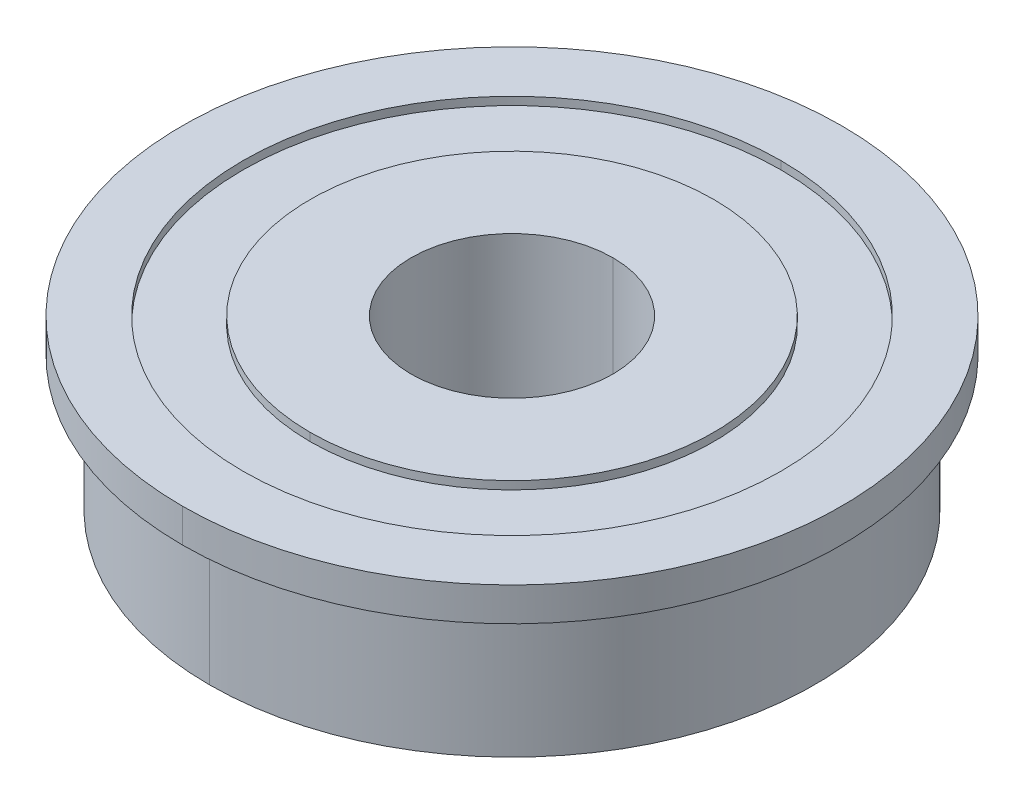
ISO-10303-21;
HEADER;
FILE_DESCRIPTION(('STEP AP214'),'2;1');
FILE_NAME('part.step','',(''),(''),'','','');
FILE_SCHEMA(('AUTOMOTIVE_DESIGN { 1 0 10303 214 1 1 1 1 }'));
ENDSEC;
DATA;
#1=APPLICATION_CONTEXT('core data for automotive mechanical design processes');
#2=APPLICATION_PROTOCOL_DEFINITION('international standard','automotive_design',2000,#1);
#3=PRODUCT_CONTEXT('',#1,'mechanical');
#4=PRODUCT('Part','Part','',(#3));
#5=PRODUCT_RELATED_PRODUCT_CATEGORY('part','',(#4));
#6=PRODUCT_DEFINITION_FORMATION('','',#4);
#7=PRODUCT_DEFINITION_CONTEXT('part definition',#1,'design');
#8=PRODUCT_DEFINITION('design','',#6,#7);
#9=PRODUCT_DEFINITION_SHAPE('','',#8);
#10=(LENGTH_UNIT() NAMED_UNIT(*) SI_UNIT(.MILLI.,.METRE.));
#11=(NAMED_UNIT(*) PLANE_ANGLE_UNIT() SI_UNIT($,.RADIAN.));
#12=(NAMED_UNIT(*) SI_UNIT($,.STERADIAN.) SOLID_ANGLE_UNIT());
#13=UNCERTAINTY_MEASURE_WITH_UNIT(LENGTH_MEASURE(1.E-05),#10,'distance_accuracy_value','');
#14=(GEOMETRIC_REPRESENTATION_CONTEXT(3) GLOBAL_UNCERTAINTY_ASSIGNED_CONTEXT((#13)) GLOBAL_UNIT_ASSIGNED_CONTEXT((#10,
#11,#12)) REPRESENTATION_CONTEXT('',''));
#15=CARTESIAN_POINT('',(0.,0.,0.));
#16=DIRECTION('',(0.,0.,1.));
#17=DIRECTION('',(1.,0.,0.));
#18=AXIS2_PLACEMENT_3D('',#15,#16,#17);
#19=CARTESIAN_POINT('',(0.,0.,0.));
#20=DIRECTION('',(0.,1.,0.));
#21=DIRECTION('',(0.,0.,1.));
#22=AXIS2_PLACEMENT_3D('',#19,#20,#21);
#23=CYLINDRICAL_SURFACE('',#22,12.7);
#24=CARTESIAN_POINT('',(0.,7.5565,0.));
#25=DIRECTION('',(0.,1.,0.));
#26=DIRECTION('',(0.,0.,1.));
#27=AXIS2_PLACEMENT_3D('',#24,#25,#26);
#28=CIRCLE('',#27,12.7);
#29=CARTESIAN_POINT('',(0.,7.5565,-12.7));
#30=VERTEX_POINT('',#29);
#31=CARTESIAN_POINT('',(0.,7.5565,12.7));
#32=VERTEX_POINT('',#31);
#33=EDGE_CURVE('E39',#30,#32,#28,.T.);
#34=ORIENTED_EDGE('',*,*,#33,.F.);
#35=DIRECTION('',(0.,1.,0.));
#36=VECTOR('',#35,1.);
#37=CARTESIAN_POINT('',(0.,0.,-12.7));
#38=LINE('',#37,#36);
#39=CARTESIAN_POINT('',(0.,7.9375,-12.7));
#40=VERTEX_POINT('',#39);
#41=EDGE_CURVE('E10',#30,#40,#38,.T.);
#42=ORIENTED_EDGE('',*,*,#41,.T.);
#43=CARTESIAN_POINT('',(0.,7.9375,0.));
#44=DIRECTION('',(0.,1.,0.));
#45=DIRECTION('',(0.,0.,1.));
#46=AXIS2_PLACEMENT_3D('',#43,#44,#45);
#47=CIRCLE('',#46,12.7);
#48=CARTESIAN_POINT('',(0.,7.9375,12.7));
#49=VERTEX_POINT('',#48);
#50=EDGE_CURVE('E27',#40,#49,#47,.T.);
#51=ORIENTED_EDGE('',*,*,#50,.T.);
#52=DIRECTION('',(0.,1.,0.));
#53=VECTOR('',#52,1.);
#54=CARTESIAN_POINT('',(0.,0.,12.7));
#55=LINE('',#54,#53);
#56=EDGE_CURVE('E118',#32,#49,#55,.T.);
#57=ORIENTED_EDGE('',*,*,#56,.F.);
#58=EDGE_LOOP('',(#34,#42,#51,#57));
#59=FACE_BOUND('',#58,.T.);
#60=ADVANCED_FACE('F16',(#59),#23,.F.);
#61=CARTESIAN_POINT('',(0.,0.,0.));
#62=DIRECTION('',(0.,1.,0.));
#63=DIRECTION('',(0.,0.,1.));
#64=AXIS2_PLACEMENT_3D('',#61,#62,#63);
#65=CYLINDRICAL_SURFACE('',#64,15.5575);
#66=CARTESIAN_POINT('',(0.,6.35,0.));
#67=DIRECTION('',(0.,1.,0.));
#68=DIRECTION('',(0.,0.,1.));
#69=AXIS2_PLACEMENT_3D('',#66,#67,#68);
#70=CIRCLE('',#69,15.5575);
#71=CARTESIAN_POINT('',(0.,6.35,15.5575));
#72=VERTEX_POINT('',#71);
#73=CARTESIAN_POINT('',(0.,6.35,-15.5575));
#74=VERTEX_POINT('',#73);
#75=EDGE_CURVE('E130',#72,#74,#70,.T.);
#76=ORIENTED_EDGE('',*,*,#75,.T.);
#77=DIRECTION('',(0.,1.,0.));
#78=VECTOR('',#77,1.);
#79=CARTESIAN_POINT('',(0.,0.,-15.5575));
#80=LINE('',#79,#78);
#81=CARTESIAN_POINT('',(0.,7.9375,-15.5575));
#82=VERTEX_POINT('',#81);
#83=EDGE_CURVE('E177',#74,#82,#80,.T.);
#84=ORIENTED_EDGE('',*,*,#83,.T.);
#85=CARTESIAN_POINT('',(0.,7.9375,0.));
#86=DIRECTION('',(0.,1.,0.));
#87=DIRECTION('',(0.,0.,1.));
#88=AXIS2_PLACEMENT_3D('',#85,#86,#87);
#89=CIRCLE('',#88,15.5575);
#90=CARTESIAN_POINT('',(0.,7.9375,15.5575));
#91=VERTEX_POINT('',#90);
#92=EDGE_CURVE('E157',#91,#82,#89,.T.);
#93=ORIENTED_EDGE('',*,*,#92,.F.);
#94=DIRECTION('',(0.,1.,0.));
#95=VECTOR('',#94,1.);
#96=CARTESIAN_POINT('',(0.,0.,15.5575));
#97=LINE('',#96,#95);
#98=EDGE_CURVE('E293',#72,#91,#97,.T.);
#99=ORIENTED_EDGE('',*,*,#98,.F.);
#100=EDGE_LOOP('',(#76,#84,#93,#99));
#101=FACE_BOUND('',#100,.T.);
#102=ADVANCED_FACE('F256',(#101),#65,.T.);
#103=CARTESIAN_POINT('',(0.,0.,0.));
#104=DIRECTION('',(0.,1.,0.));
#105=DIRECTION('',(0.,0.,1.));
#106=AXIS2_PLACEMENT_3D('',#103,#104,#105);
#107=CYLINDRICAL_SURFACE('',#106,14.2875);
#108=CARTESIAN_POINT('',(0.,0.,0.));
#109=DIRECTION('',(0.,1.,0.));
#110=DIRECTION('',(0.,0.,1.));
#111=AXIS2_PLACEMENT_3D('',#108,#109,#110);
#112=CIRCLE('',#111,14.2875);
#113=CARTESIAN_POINT('',(0.,0.,14.2875));
#114=VERTEX_POINT('',#113);
#115=CARTESIAN_POINT('',(0.,0.,-14.2875));
#116=VERTEX_POINT('',#115);
#117=EDGE_CURVE('E169',#114,#116,#112,.T.);
#118=ORIENTED_EDGE('',*,*,#117,.T.);
#119=DIRECTION('',(0.,1.,0.));
#120=VECTOR('',#119,1.);
#121=CARTESIAN_POINT('',(0.,0.,-14.2875));
#122=LINE('',#121,#120);
#123=CARTESIAN_POINT('',(0.,6.35,-14.2875));
#124=VERTEX_POINT('',#123);
#125=EDGE_CURVE('E166',#116,#124,#122,.T.);
#126=ORIENTED_EDGE('',*,*,#125,.T.);
#127=CARTESIAN_POINT('',(0.,6.35,0.));
#128=DIRECTION('',(0.,1.,0.));
#129=DIRECTION('',(0.,0.,1.));
#130=AXIS2_PLACEMENT_3D('',#127,#128,#129);
#131=CIRCLE('',#130,14.2875);
#132=CARTESIAN_POINT('',(0.,6.35,14.2875));
#133=VERTEX_POINT('',#132);
#134=EDGE_CURVE('E192',#133,#124,#131,.T.);
#135=ORIENTED_EDGE('',*,*,#134,.F.);
#136=DIRECTION('',(0.,1.,0.));
#137=VECTOR('',#136,1.);
#138=CARTESIAN_POINT('',(0.,0.,14.2875));
#139=LINE('',#138,#137);
#140=EDGE_CURVE('E225',#114,#133,#139,.T.);
#141=ORIENTED_EDGE('',*,*,#140,.F.);
#142=EDGE_LOOP('',(#118,#126,#135,#141));
#143=FACE_BOUND('',#142,.T.);
#144=ADVANCED_FACE('F252',(#143),#107,.T.);
#145=CARTESIAN_POINT('',(0.,0.,0.));
#146=DIRECTION('',(0.,1.,0.));
#147=DIRECTION('',(0.,0.,1.));
#148=AXIS2_PLACEMENT_3D('',#145,#146,#147);
#149=CYLINDRICAL_SURFACE('',#148,4.7625);
#150=CARTESIAN_POINT('',(0.,0.,0.));
#151=DIRECTION('',(0.,1.,0.));
#152=DIRECTION('',(0.,0.,1.));
#153=AXIS2_PLACEMENT_3D('',#150,#151,#152);
#154=CIRCLE('',#153,4.7625);
#155=CARTESIAN_POINT('',(0.,0.,-4.7625));
#156=VERTEX_POINT('',#155);
#157=CARTESIAN_POINT('',(0.,0.,4.7625));
#158=VERTEX_POINT('',#157);
#159=EDGE_CURVE('E153',#156,#158,#154,.T.);
#160=ORIENTED_EDGE('',*,*,#159,.F.);
#161=DIRECTION('',(0.,1.,0.));
#162=VECTOR('',#161,1.);
#163=CARTESIAN_POINT('',(0.,0.,-4.7625));
#164=LINE('',#163,#162);
#165=CARTESIAN_POINT('',(0.,7.9375,-4.7625));
#166=VERTEX_POINT('',#165);
#167=EDGE_CURVE('E165',#156,#166,#164,.T.);
#168=ORIENTED_EDGE('',*,*,#167,.T.);
#169=CARTESIAN_POINT('',(0.,7.9375,0.));
#170=DIRECTION('',(0.,1.,0.));
#171=DIRECTION('',(0.,0.,1.));
#172=AXIS2_PLACEMENT_3D('',#169,#170,#171);
#173=CIRCLE('',#172,4.7625);
#174=CARTESIAN_POINT('',(0.,7.9375,4.7625));
#175=VERTEX_POINT('',#174);
#176=EDGE_CURVE('E162',#166,#175,#173,.T.);
#177=ORIENTED_EDGE('',*,*,#176,.T.);
#178=DIRECTION('',(0.,1.,0.));
#179=VECTOR('',#178,1.);
#180=CARTESIAN_POINT('',(0.,0.,4.7625));
#181=LINE('',#180,#179);
#182=EDGE_CURVE('E161',#158,#175,#181,.T.);
#183=ORIENTED_EDGE('',*,*,#182,.F.);
#184=EDGE_LOOP('',(#160,#168,#177,#183));
#185=FACE_BOUND('',#184,.T.);
#186=ADVANCED_FACE('F18',(#185),#149,.F.);
#187=CARTESIAN_POINT('',(0.,0.,0.));
#188=DIRECTION('',(0.,1.,0.));
#189=DIRECTION('',(0.,0.,1.));
#190=AXIS2_PLACEMENT_3D('',#187,#188,#189);
#191=CYLINDRICAL_SURFACE('',#190,9.525);
#192=CARTESIAN_POINT('',(0.,7.5565,0.));
#193=DIRECTION('',(0.,1.,0.));
#194=DIRECTION('',(0.,0.,1.));
#195=AXIS2_PLACEMENT_3D('',#192,#193,#194);
#196=CIRCLE('',#195,9.525);
#197=CARTESIAN_POINT('',(0.,7.5565,9.525));
#198=VERTEX_POINT('',#197);
#199=CARTESIAN_POINT('',(0.,7.5565,-9.525));
#200=VERTEX_POINT('',#199);
#201=EDGE_CURVE('E20',#198,#200,#196,.T.);
#202=ORIENTED_EDGE('',*,*,#201,.T.);
#203=DIRECTION('',(0.,1.,0.));
#204=VECTOR('',#203,1.);
#205=CARTESIAN_POINT('',(0.,0.,-9.525));
#206=LINE('',#205,#204);
#207=CARTESIAN_POINT('',(0.,7.9375,-9.525));
#208=VERTEX_POINT('',#207);
#209=EDGE_CURVE('E144',#200,#208,#206,.T.);
#210=ORIENTED_EDGE('',*,*,#209,.T.);
#211=CARTESIAN_POINT('',(0.,7.9375,0.));
#212=DIRECTION('',(0.,1.,0.));
#213=DIRECTION('',(0.,0.,1.));
#214=AXIS2_PLACEMENT_3D('',#211,#212,#213);
#215=CIRCLE('',#214,9.525);
#216=CARTESIAN_POINT('',(0.,7.9375,9.525));
#217=VERTEX_POINT('',#216);
#218=EDGE_CURVE('E220',#217,#208,#215,.T.);
#219=ORIENTED_EDGE('',*,*,#218,.F.);
#220=DIRECTION('',(0.,1.,0.));
#221=VECTOR('',#220,1.);
#222=CARTESIAN_POINT('',(0.,0.,9.525));
#223=LINE('',#222,#221);
#224=EDGE_CURVE('E212',#198,#217,#223,.T.);
#225=ORIENTED_EDGE('',*,*,#224,.F.);
#226=EDGE_LOOP('',(#202,#210,#219,#225));
#227=FACE_BOUND('',#226,.T.);
#228=ADVANCED_FACE('F243',(#227),#191,.T.);
#229=CARTESIAN_POINT('',(0.,0.,0.));
#230=DIRECTION('',(0.,1.,0.));
#231=DIRECTION('',(0.,0.,1.));
#232=AXIS2_PLACEMENT_3D('',#229,#230,#231);
#233=CYLINDRICAL_SURFACE('',#232,9.525);
#234=ORIENTED_EDGE('',*,*,#209,.F.);
#235=CARTESIAN_POINT('',(0.,7.5565,0.));
#236=DIRECTION('',(0.,1.,0.));
#237=DIRECTION('',(0.,0.,1.));
#238=AXIS2_PLACEMENT_3D('',#235,#236,#237);
#239=CIRCLE('',#238,9.525);
#240=EDGE_CURVE('E147',#200,#198,#239,.T.);
#241=ORIENTED_EDGE('',*,*,#240,.T.);
#242=ORIENTED_EDGE('',*,*,#224,.T.);
#243=CARTESIAN_POINT('',(0.,7.9375,0.));
#244=DIRECTION('',(0.,1.,0.));
#245=DIRECTION('',(0.,0.,1.));
#246=AXIS2_PLACEMENT_3D('',#243,#244,#245);
#247=CIRCLE('',#246,9.525);
#248=EDGE_CURVE('E232',#208,#217,#247,.T.);
#249=ORIENTED_EDGE('',*,*,#248,.F.);
#250=EDGE_LOOP('',(#234,#241,#242,#249));
#251=FACE_BOUND('',#250,.T.);
#252=ADVANCED_FACE('F210',(#251),#233,.T.);
#253=CARTESIAN_POINT('',(4.7625,7.9375,0.));
#254=DIRECTION('',(0.,1.,0.));
#255=DIRECTION('',(1.,0.,0.));
#256=AXIS2_PLACEMENT_3D('',#253,#254,#255);
#257=PLANE('',#256);
#258=ORIENTED_EDGE('',*,*,#218,.T.);
#259=ORIENTED_EDGE('',*,*,#248,.T.);
#260=EDGE_LOOP('',(#258,#259));
#261=FACE_BOUND('',#260,.T.);
#262=CARTESIAN_POINT('',(0.,7.9375,0.));
#263=DIRECTION('',(0.,1.,0.));
#264=DIRECTION('',(0.,0.,1.));
#265=AXIS2_PLACEMENT_3D('',#262,#263,#264);
#266=CIRCLE('',#265,4.7625);
#267=EDGE_CURVE('E152',#175,#166,#266,.T.);
#268=ORIENTED_EDGE('',*,*,#267,.F.);
#269=ORIENTED_EDGE('',*,*,#176,.F.);
#270=EDGE_LOOP('',(#268,#269));
#271=FACE_BOUND('',#270,.T.);
#272=ADVANCED_FACE('F241',(#261,#271),#257,.T.);
#273=CARTESIAN_POINT('',(0.,0.,0.));
#274=DIRECTION('',(0.,1.,0.));
#275=DIRECTION('',(0.,0.,1.));
#276=AXIS2_PLACEMENT_3D('',#273,#274,#275);
#277=CYLINDRICAL_SURFACE('',#276,4.7625);
#278=ORIENTED_EDGE('',*,*,#167,.F.);
#279=CARTESIAN_POINT('',(0.,0.,0.));
#280=DIRECTION('',(0.,1.,0.));
#281=DIRECTION('',(0.,0.,1.));
#282=AXIS2_PLACEMENT_3D('',#279,#280,#281);
#283=CIRCLE('',#282,4.7625);
#284=EDGE_CURVE('E148',#158,#156,#283,.T.);
#285=ORIENTED_EDGE('',*,*,#284,.F.);
#286=ORIENTED_EDGE('',*,*,#182,.T.);
#287=ORIENTED_EDGE('',*,*,#267,.T.);
#288=EDGE_LOOP('',(#278,#285,#286,#287));
#289=FACE_BOUND('',#288,.T.);
#290=ADVANCED_FACE('F342',(#289),#277,.F.);
#291=CARTESIAN_POINT('',(14.2875,0.,0.));
#292=DIRECTION('',(0.,-1.,0.));
#293=DIRECTION('',(0.,0.,-1.));
#294=AXIS2_PLACEMENT_3D('',#291,#292,#293);
#295=PLANE('',#294);
#296=ORIENTED_EDGE('',*,*,#117,.F.);
#297=CARTESIAN_POINT('',(0.,0.,0.));
#298=DIRECTION('',(0.,1.,0.));
#299=DIRECTION('',(0.,0.,1.));
#300=AXIS2_PLACEMENT_3D('',#297,#298,#299);
#301=CIRCLE('',#300,14.2875);
#302=EDGE_CURVE('E228',#116,#114,#301,.T.);
#303=ORIENTED_EDGE('',*,*,#302,.F.);
#304=EDGE_LOOP('',(#296,#303));
#305=FACE_BOUND('',#304,.T.);
#306=ORIENTED_EDGE('',*,*,#284,.T.);
#307=ORIENTED_EDGE('',*,*,#159,.T.);
#308=EDGE_LOOP('',(#306,#307));
#309=FACE_BOUND('',#308,.T.);
#310=ADVANCED_FACE('F265',(#305,#309),#295,.T.);
#311=CARTESIAN_POINT('',(0.,0.,0.));
#312=DIRECTION('',(0.,1.,0.));
#313=DIRECTION('',(0.,0.,1.));
#314=AXIS2_PLACEMENT_3D('',#311,#312,#313);
#315=CYLINDRICAL_SURFACE('',#314,14.2875);
#316=ORIENTED_EDGE('',*,*,#125,.F.);
#317=ORIENTED_EDGE('',*,*,#302,.T.);
#318=ORIENTED_EDGE('',*,*,#140,.T.);
#319=CARTESIAN_POINT('',(0.,6.35,0.));
#320=DIRECTION('',(0.,1.,0.));
#321=DIRECTION('',(0.,0.,1.));
#322=AXIS2_PLACEMENT_3D('',#319,#320,#321);
#323=CIRCLE('',#322,14.2875);
#324=EDGE_CURVE('E189',#124,#133,#323,.T.);
#325=ORIENTED_EDGE('',*,*,#324,.F.);
#326=EDGE_LOOP('',(#316,#317,#318,#325));
#327=FACE_BOUND('',#326,.T.);
#328=ADVANCED_FACE('F275',(#327),#315,.T.);
#329=CARTESIAN_POINT('',(15.5575,6.35,0.));
#330=DIRECTION('',(0.,-1.,0.));
#331=DIRECTION('',(0.,0.,-1.));
#332=AXIS2_PLACEMENT_3D('',#329,#330,#331);
#333=PLANE('',#332);
#334=ORIENTED_EDGE('',*,*,#75,.F.);
#335=CARTESIAN_POINT('',(0.,6.35,0.));
#336=DIRECTION('',(0.,1.,0.));
#337=DIRECTION('',(0.,0.,1.));
#338=AXIS2_PLACEMENT_3D('',#335,#336,#337);
#339=CIRCLE('',#338,15.5575);
#340=EDGE_CURVE('E193',#74,#72,#339,.T.);
#341=ORIENTED_EDGE('',*,*,#340,.F.);
#342=EDGE_LOOP('',(#334,#341));
#343=FACE_BOUND('',#342,.T.);
#344=ORIENTED_EDGE('',*,*,#134,.T.);
#345=ORIENTED_EDGE('',*,*,#324,.T.);
#346=EDGE_LOOP('',(#344,#345));
#347=FACE_BOUND('',#346,.T.);
#348=ADVANCED_FACE('F271',(#343,#347),#333,.T.);
#349=CARTESIAN_POINT('',(0.,0.,0.));
#350=DIRECTION('',(0.,1.,0.));
#351=DIRECTION('',(0.,0.,1.));
#352=AXIS2_PLACEMENT_3D('',#349,#350,#351);
#353=CYLINDRICAL_SURFACE('',#352,15.5575);
#354=ORIENTED_EDGE('',*,*,#83,.F.);
#355=ORIENTED_EDGE('',*,*,#340,.T.);
#356=ORIENTED_EDGE('',*,*,#98,.T.);
#357=CARTESIAN_POINT('',(0.,7.9375,0.));
#358=DIRECTION('',(0.,1.,0.));
#359=DIRECTION('',(0.,0.,1.));
#360=AXIS2_PLACEMENT_3D('',#357,#358,#359);
#361=CIRCLE('',#360,15.5575);
#362=EDGE_CURVE('E126',#82,#91,#361,.T.);
#363=ORIENTED_EDGE('',*,*,#362,.F.);
#364=EDGE_LOOP('',(#354,#355,#356,#363));
#365=FACE_BOUND('',#364,.T.);
#366=ADVANCED_FACE('F268',(#365),#353,.T.);
#367=CARTESIAN_POINT('',(12.7,7.9375,0.));
#368=DIRECTION('',(0.,1.,0.));
#369=DIRECTION('',(1.,0.,0.));
#370=AXIS2_PLACEMENT_3D('',#367,#368,#369);
#371=PLANE('',#370);
#372=ORIENTED_EDGE('',*,*,#92,.T.);
#373=ORIENTED_EDGE('',*,*,#362,.T.);
#374=EDGE_LOOP('',(#372,#373));
#375=FACE_BOUND('',#374,.T.);
#376=CARTESIAN_POINT('',(0.,7.9375,0.));
#377=DIRECTION('',(0.,1.,0.));
#378=DIRECTION('',(0.,0.,1.));
#379=AXIS2_PLACEMENT_3D('',#376,#377,#378);
#380=CIRCLE('',#379,12.7);
#381=EDGE_CURVE('E122',#49,#40,#380,.T.);
#382=ORIENTED_EDGE('',*,*,#381,.F.);
#383=ORIENTED_EDGE('',*,*,#50,.F.);
#384=EDGE_LOOP('',(#382,#383));
#385=FACE_BOUND('',#384,.T.);
#386=ADVANCED_FACE('F132',(#375,#385),#371,.T.);
#387=CARTESIAN_POINT('',(0.,0.,0.));
#388=DIRECTION('',(0.,1.,0.));
#389=DIRECTION('',(0.,0.,1.));
#390=AXIS2_PLACEMENT_3D('',#387,#388,#389);
#391=CYLINDRICAL_SURFACE('',#390,12.7);
#392=ORIENTED_EDGE('',*,*,#41,.F.);
#393=CARTESIAN_POINT('',(0.,7.5565,0.));
#394=DIRECTION('',(0.,1.,0.));
#395=DIRECTION('',(0.,0.,1.));
#396=AXIS2_PLACEMENT_3D('',#393,#394,#395);
#397=CIRCLE('',#396,12.7);
#398=EDGE_CURVE('E124',#32,#30,#397,.T.);
#399=ORIENTED_EDGE('',*,*,#398,.F.);
#400=ORIENTED_EDGE('',*,*,#56,.T.);
#401=ORIENTED_EDGE('',*,*,#381,.T.);
#402=EDGE_LOOP('',(#392,#399,#400,#401));
#403=FACE_BOUND('',#402,.T.);
#404=ADVANCED_FACE('F120',(#403),#391,.F.);
#405=CARTESIAN_POINT('',(9.525,7.5565,0.));
#406=DIRECTION('',(0.,1.,0.));
#407=DIRECTION('',(1.,0.,0.));
#408=AXIS2_PLACEMENT_3D('',#405,#406,#407);
#409=PLANE('',#408);
#410=ORIENTED_EDGE('',*,*,#398,.T.);
#411=ORIENTED_EDGE('',*,*,#33,.T.);
#412=EDGE_LOOP('',(#410,#411));
#413=FACE_BOUND('',#412,.T.);
#414=ORIENTED_EDGE('',*,*,#201,.F.);
#415=ORIENTED_EDGE('',*,*,#240,.F.);
#416=EDGE_LOOP('',(#414,#415));
#417=FACE_BOUND('',#416,.T.);
#418=ADVANCED_FACE('F200',(#413,#417),#409,.T.);
#419=CLOSED_SHELL('',(#60,#102,#144,#186,#228,#252,#272,#290,#310,#328,#348,#366,#386,#404,#418));
#420=MANIFOLD_SOLID_BREP('B1',#419);
#421=ADVANCED_BREP_SHAPE_REPRESENTATION('',(#18,#420),#14);
#422=SHAPE_DEFINITION_REPRESENTATION(#9,#421);
ENDSEC;
END-ISO-10303-21;
